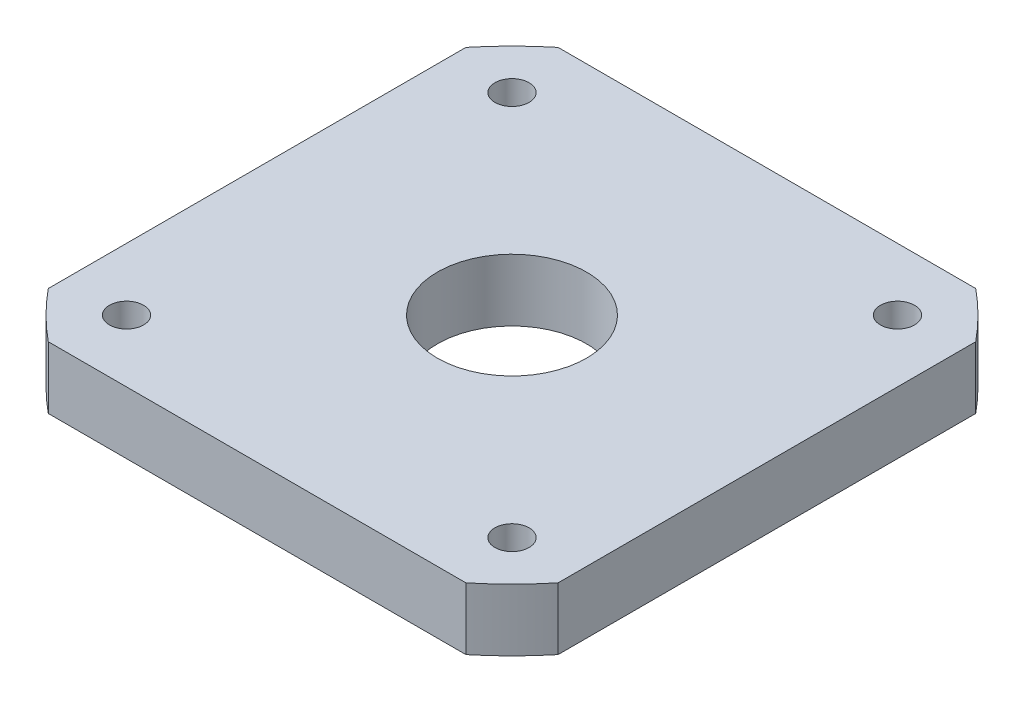
ISO-10303-21;
HEADER;
FILE_DESCRIPTION(('STEP AP214'),'2;1');
FILE_NAME('part.step','',(''),(''),'','','');
FILE_SCHEMA(('AUTOMOTIVE_DESIGN { 1 0 10303 214 1 1 1 1 }'));
ENDSEC;
DATA;
#1=APPLICATION_CONTEXT('core data for automotive mechanical design processes');
#2=APPLICATION_PROTOCOL_DEFINITION('international standard','automotive_design',2000,#1);
#3=PRODUCT_CONTEXT('',#1,'mechanical');
#4=PRODUCT('Part','Part','',(#3));
#5=PRODUCT_RELATED_PRODUCT_CATEGORY('part','',(#4));
#6=PRODUCT_DEFINITION_FORMATION('','',#4);
#7=PRODUCT_DEFINITION_CONTEXT('part definition',#1,'design');
#8=PRODUCT_DEFINITION('design','',#6,#7);
#9=PRODUCT_DEFINITION_SHAPE('','',#8);
#10=(LENGTH_UNIT() NAMED_UNIT(*) SI_UNIT(.MILLI.,.METRE.));
#11=(NAMED_UNIT(*) PLANE_ANGLE_UNIT() SI_UNIT($,.RADIAN.));
#12=(NAMED_UNIT(*) SI_UNIT($,.STERADIAN.) SOLID_ANGLE_UNIT());
#13=UNCERTAINTY_MEASURE_WITH_UNIT(LENGTH_MEASURE(1.E-05),#10,'distance_accuracy_value','');
#14=(GEOMETRIC_REPRESENTATION_CONTEXT(3) GLOBAL_UNCERTAINTY_ASSIGNED_CONTEXT((#13)) GLOBAL_UNIT_ASSIGNED_CONTEXT((#10,
#11,#12)) REPRESENTATION_CONTEXT('',''));
#15=CARTESIAN_POINT('',(0.,0.,0.));
#16=DIRECTION('',(0.,0.,1.));
#17=DIRECTION('',(1.,0.,0.));
#18=AXIS2_PLACEMENT_3D('',#15,#16,#17);
#19=CARTESIAN_POINT('',(-0.499999999999889,-8.73972731136372,4.7175293035262E-11));
#20=DIRECTION('',(0.,1.,0.));
#21=DIRECTION('',(0.,0.,1.));
#22=AXIS2_PLACEMENT_3D('',#19,#20,#21);
#23=PLANE('',#22);
#24=CARTESIAN_POINT('',(-15.9999999999999,-8.73972731136403,15.5000000000507));
#25=DIRECTION('',(0.,1.,0.));
#26=DIRECTION('',(0.,0.,1.));
#27=AXIS2_PLACEMENT_3D('',#24,#25,#26);
#28=CIRCLE('',#27,1.375);
#29=CARTESIAN_POINT('',(-15.9999999999999,-8.73972731136405,16.8750000000507));
#30=VERTEX_POINT('',#29);
#31=EDGE_CURVE('E199',#30,#30,#28,.T.);
#32=ORIENTED_EDGE('',*,*,#31,.F.);
#33=EDGE_LOOP('',(#32));
#34=FACE_BOUND('',#33,.T.);
#35=CARTESIAN_POINT('',(-15.9999999999999,-8.73972731136342,-15.49999999995));
#36=DIRECTION('',(0.,1.,0.));
#37=DIRECTION('',(0.,0.,1.));
#38=AXIS2_PLACEMENT_3D('',#35,#36,#37);
#39=CIRCLE('',#38,1.375);
#40=CARTESIAN_POINT('',(-15.9999999999999,-8.73972731136345,-14.12499999995));
#41=VERTEX_POINT('',#40);
#42=EDGE_CURVE('E187',#41,#41,#39,.T.);
#43=ORIENTED_EDGE('',*,*,#42,.F.);
#44=EDGE_LOOP('',(#43));
#45=FACE_BOUND('',#44,.T.);
#46=CARTESIAN_POINT('',(-0.499999999999889,-8.73972731136372,4.7175293035262E-11));
#47=DIRECTION('',(0.,1.,0.));
#48=DIRECTION('',(0.,0.,1.));
#49=AXIS2_PLACEMENT_3D('',#46,#47,#48);
#50=CIRCLE('',#49,26.4999999999986);
#51=CARTESIAN_POINT('',(20.0000000000001,-8.73972731136339,-16.7928556236976));
#52=VERTEX_POINT('',#51);
#53=CARTESIAN_POINT('',(16.2928556237471,-8.73972731136332,-20.4999999999506));
#54=VERTEX_POINT('',#53);
#55=EDGE_CURVE('E151',#52,#54,#50,.T.);
#56=ORIENTED_EDGE('',*,*,#55,.T.);
#57=DIRECTION('',(-1.,0.,0.));
#58=VECTOR('',#57,1.);
#59=CARTESIAN_POINT('',(16.2928556237471,-8.73972731136332,-20.4999999999506));
#60=LINE('',#59,#58);
#61=CARTESIAN_POINT('',(-17.2928556237399,-8.73972731136332,-20.4999999999506));
#62=VERTEX_POINT('',#61);
#63=EDGE_CURVE('E97',#54,#62,#60,.T.);
#64=ORIENTED_EDGE('',*,*,#63,.T.);
#65=CARTESIAN_POINT('',(-0.499999999999889,-8.73972731136372,4.7175293035262E-11));
#66=DIRECTION('',(0.,1.,0.));
#67=DIRECTION('',(0.,0.,1.));
#68=AXIS2_PLACEMENT_3D('',#65,#66,#67);
#69=CIRCLE('',#68,26.4999999999953);
#70=CARTESIAN_POINT('',(-20.9999999999972,-8.73972731136339,-16.7928556236954));
#71=VERTEX_POINT('',#70);
#72=EDGE_CURVE('E167',#62,#71,#69,.T.);
#73=ORIENTED_EDGE('',*,*,#72,.T.);
#74=DIRECTION('',(0.,0.,1.));
#75=VECTOR('',#74,1.);
#76=CARTESIAN_POINT('',(-20.9999999999982,-8.73972731136339,-16.7928556236962));
#77=LINE('',#76,#75);
#78=CARTESIAN_POINT('',(-20.9999999999999,-8.73972731136405,16.7928556237894));
#79=VERTEX_POINT('',#78);
#80=EDGE_CURVE('E176',#71,#79,#77,.T.);
#81=ORIENTED_EDGE('',*,*,#80,.T.);
#82=CARTESIAN_POINT('',(-0.499999999999889,-8.73972731136372,4.7175293035262E-11));
#83=DIRECTION('',(0.,1.,0.));
#84=DIRECTION('',(0.,0.,1.));
#85=AXIS2_PLACEMENT_3D('',#82,#83,#84);
#86=CIRCLE('',#85,26.4999999999974);
#87=CARTESIAN_POINT('',(-17.2928556237398,-8.73972731136412,20.5000000000493));
#88=VERTEX_POINT('',#87);
#89=EDGE_CURVE('E117',#79,#88,#86,.T.);
#90=ORIENTED_EDGE('',*,*,#89,.T.);
#91=DIRECTION('',(1.,0.,0.));
#92=VECTOR('',#91,1.);
#93=CARTESIAN_POINT('',(-17.2928556237399,-8.73972731136412,20.5000000000494));
#94=LINE('',#93,#92);
#95=CARTESIAN_POINT('',(16.2928556237471,-8.73972731136412,20.5000000000494));
#96=VERTEX_POINT('',#95);
#97=EDGE_CURVE('E115',#88,#96,#94,.T.);
#98=ORIENTED_EDGE('',*,*,#97,.T.);
#99=CARTESIAN_POINT('',(-0.499999999999889,-8.73972731136372,4.7175293035262E-11));
#100=DIRECTION('',(0.,1.,0.));
#101=DIRECTION('',(0.,0.,1.));
#102=AXIS2_PLACEMENT_3D('',#99,#100,#101);
#103=CIRCLE('',#102,26.5000000000007);
#104=CARTESIAN_POINT('',(20.0000000000028,-8.73972731136405,16.7928556237916));
#105=VERTEX_POINT('',#104);
#106=EDGE_CURVE('E116',#96,#105,#103,.T.);
#107=ORIENTED_EDGE('',*,*,#106,.T.);
#108=DIRECTION('',(0.,0.,-1.));
#109=VECTOR('',#108,1.);
#110=CARTESIAN_POINT('',(20.0000000000018,-8.73972731136405,16.7928556237908));
#111=LINE('',#110,#109);
#112=EDGE_CURVE('E57',#105,#52,#111,.T.);
#113=ORIENTED_EDGE('',*,*,#112,.T.);
#114=EDGE_LOOP('',(#56,#64,#73,#81,#90,#98,#107,#113));
#115=FACE_BOUND('',#114,.T.);
#116=CARTESIAN_POINT('',(-0.499999999999889,-8.73972731136372,4.7175293035262E-11));
#117=DIRECTION('',(0.,1.,0.));
#118=DIRECTION('',(0.,0.,1.));
#119=AXIS2_PLACEMENT_3D('',#116,#117,#118);
#120=CIRCLE('',#119,6.00000000001366);
#121=CARTESIAN_POINT('',(-0.499999999999889,-8.73972731136384,6.00000000006084));
#122=VERTEX_POINT('',#121);
#123=EDGE_CURVE('E138',#122,#122,#120,.T.);
#124=ORIENTED_EDGE('',*,*,#123,.F.);
#125=EDGE_LOOP('',(#124));
#126=FACE_BOUND('',#125,.T.);
#127=CARTESIAN_POINT('',(15.0000000000001,-8.73972731136342,-15.4999999999494));
#128=DIRECTION('',(0.,1.,0.));
#129=DIRECTION('',(0.,0.,1.));
#130=AXIS2_PLACEMENT_3D('',#127,#128,#129);
#131=CIRCLE('',#130,1.375);
#132=CARTESIAN_POINT('',(15.0000000000001,-8.73972731136345,-14.1249999999494));
#133=VERTEX_POINT('',#132);
#134=EDGE_CURVE('E191',#133,#133,#131,.T.);
#135=ORIENTED_EDGE('',*,*,#134,.F.);
#136=EDGE_LOOP('',(#135));
#137=FACE_BOUND('',#136,.T.);
#138=CARTESIAN_POINT('',(15.0000000000001,-8.73972731136403,15.5000000000494));
#139=DIRECTION('',(0.,1.,0.));
#140=DIRECTION('',(0.,0.,1.));
#141=AXIS2_PLACEMENT_3D('',#138,#139,#140);
#142=CIRCLE('',#141,1.375);
#143=CARTESIAN_POINT('',(15.0000000000001,-8.73972731136405,16.8750000000494));
#144=VERTEX_POINT('',#143);
#145=EDGE_CURVE('E206',#144,#144,#142,.T.);
#146=ORIENTED_EDGE('',*,*,#145,.F.);
#147=EDGE_LOOP('',(#146));
#148=FACE_BOUND('',#147,.T.);
#149=ADVANCED_FACE('F39',(#34,#45,#115,#126,#137,#148),#23,.T.);
#150=CARTESIAN_POINT('',(-0.499999999999889,-13.7397273113637,4.70766485950967E-11));
#151=DIRECTION('',(0.,1.,0.));
#152=DIRECTION('',(0.,0.,1.));
#153=AXIS2_PLACEMENT_3D('',#150,#151,#152);
#154=PLANE('',#153);
#155=CARTESIAN_POINT('',(-0.499999999999889,-13.7397273113637,4.70766485950967E-11));
#156=DIRECTION('',(0.,1.,0.));
#157=DIRECTION('',(0.,0.,1.));
#158=AXIS2_PLACEMENT_3D('',#155,#156,#157);
#159=CIRCLE('',#158,26.4999999999986);
#160=CARTESIAN_POINT('',(20.0000000000001,-13.7397273113634,-16.7928556236977));
#161=VERTEX_POINT('',#160);
#162=CARTESIAN_POINT('',(16.2928556237471,-13.7397273113633,-20.4999999999507));
#163=VERTEX_POINT('',#162);
#164=EDGE_CURVE('E137',#161,#163,#159,.T.);
#165=ORIENTED_EDGE('',*,*,#164,.F.);
#166=DIRECTION('',(0.,0.,-1.));
#167=VECTOR('',#166,1.);
#168=CARTESIAN_POINT('',(20.0000000000018,-13.7397273113641,16.7928556237907));
#169=LINE('',#168,#167);
#170=CARTESIAN_POINT('',(20.0000000000028,-13.7397273113641,16.7928556237915));
#171=VERTEX_POINT('',#170);
#172=EDGE_CURVE('E93',#171,#161,#169,.T.);
#173=ORIENTED_EDGE('',*,*,#172,.F.);
#174=CARTESIAN_POINT('',(-0.499999999999889,-13.7397273113637,4.70766485950967E-11));
#175=DIRECTION('',(0.,1.,0.));
#176=DIRECTION('',(0.,0.,1.));
#177=AXIS2_PLACEMENT_3D('',#174,#175,#176);
#178=CIRCLE('',#177,26.5000000000007);
#179=CARTESIAN_POINT('',(16.2928556237471,-13.7397273113641,20.5000000000493));
#180=VERTEX_POINT('',#179);
#181=EDGE_CURVE('E83',#180,#171,#178,.T.);
#182=ORIENTED_EDGE('',*,*,#181,.F.);
#183=DIRECTION('',(1.,0.,0.));
#184=VECTOR('',#183,1.);
#185=CARTESIAN_POINT('',(-17.2928556237399,-13.7397273113641,20.5000000000493));
#186=LINE('',#185,#184);
#187=CARTESIAN_POINT('',(-17.2928556237398,-13.7397273113641,20.5000000000492));
#188=VERTEX_POINT('',#187);
#189=EDGE_CURVE('E127',#188,#180,#186,.T.);
#190=ORIENTED_EDGE('',*,*,#189,.F.);
#191=CARTESIAN_POINT('',(-0.499999999999889,-13.7397273113637,4.70766485950967E-11));
#192=DIRECTION('',(0.,1.,0.));
#193=DIRECTION('',(0.,0.,1.));
#194=AXIS2_PLACEMENT_3D('',#191,#192,#193);
#195=CIRCLE('',#194,26.4999999999974);
#196=CARTESIAN_POINT('',(-20.9999999999999,-13.7397273113641,16.7928556237893));
#197=VERTEX_POINT('',#196);
#198=EDGE_CURVE('E148',#197,#188,#195,.T.);
#199=ORIENTED_EDGE('',*,*,#198,.F.);
#200=DIRECTION('',(0.,0.,1.));
#201=VECTOR('',#200,1.);
#202=CARTESIAN_POINT('',(-20.9999999999982,-13.7397273113634,-16.7928556236963));
#203=LINE('',#202,#201);
#204=CARTESIAN_POINT('',(-20.9999999999972,-13.7397273113634,-16.7928556236955));
#205=VERTEX_POINT('',#204);
#206=EDGE_CURVE('E145',#205,#197,#203,.T.);
#207=ORIENTED_EDGE('',*,*,#206,.F.);
#208=CARTESIAN_POINT('',(-0.499999999999889,-13.7397273113637,4.70766485950967E-11));
#209=DIRECTION('',(0.,1.,0.));
#210=DIRECTION('',(0.,0.,1.));
#211=AXIS2_PLACEMENT_3D('',#208,#209,#210);
#212=CIRCLE('',#211,26.4999999999953);
#213=CARTESIAN_POINT('',(-17.2928556237399,-13.7397273113633,-20.4999999999507));
#214=VERTEX_POINT('',#213);
#215=EDGE_CURVE('E142',#214,#205,#212,.T.);
#216=ORIENTED_EDGE('',*,*,#215,.F.);
#217=DIRECTION('',(-1.,0.,0.));
#218=VECTOR('',#217,1.);
#219=CARTESIAN_POINT('',(16.2928556237471,-13.7397273113633,-20.4999999999507));
#220=LINE('',#219,#218);
#221=EDGE_CURVE('E136',#163,#214,#220,.T.);
#222=ORIENTED_EDGE('',*,*,#221,.F.);
#223=EDGE_LOOP('',(#165,#173,#182,#190,#199,#207,#216,#222));
#224=FACE_BOUND('',#223,.T.);
#225=CARTESIAN_POINT('',(-0.499999999999889,-13.7397273113637,4.70766485950967E-11));
#226=DIRECTION('',(0.,1.,0.));
#227=DIRECTION('',(0.,0.,1.));
#228=AXIS2_PLACEMENT_3D('',#225,#226,#227);
#229=CIRCLE('',#228,6.00000000001366);
#230=CARTESIAN_POINT('',(-0.499999999999889,-13.7397273113638,6.00000000006074));
#231=VERTEX_POINT('',#230);
#232=EDGE_CURVE('E183',#231,#231,#229,.T.);
#233=ORIENTED_EDGE('',*,*,#232,.T.);
#234=EDGE_LOOP('',(#233));
#235=FACE_BOUND('',#234,.T.);
#236=CARTESIAN_POINT('',(-15.9999999999999,-13.7397273113634,-15.4999999999501));
#237=DIRECTION('',(0.,1.,0.));
#238=DIRECTION('',(0.,0.,1.));
#239=AXIS2_PLACEMENT_3D('',#236,#237,#238);
#240=CIRCLE('',#239,1.375);
#241=CARTESIAN_POINT('',(-15.9999999999999,-13.7397273113634,-14.1249999999501));
#242=VERTEX_POINT('',#241);
#243=EDGE_CURVE('E192',#242,#242,#240,.T.);
#244=ORIENTED_EDGE('',*,*,#243,.T.);
#245=EDGE_LOOP('',(#244));
#246=FACE_BOUND('',#245,.T.);
#247=CARTESIAN_POINT('',(15.0000000000001,-13.7397273113634,-15.4999999999495));
#248=DIRECTION('',(0.,1.,0.));
#249=DIRECTION('',(0.,0.,1.));
#250=AXIS2_PLACEMENT_3D('',#247,#248,#249);
#251=CIRCLE('',#250,1.375);
#252=CARTESIAN_POINT('',(15.0000000000001,-13.7397273113634,-14.1249999999495));
#253=VERTEX_POINT('',#252);
#254=EDGE_CURVE('E197',#253,#253,#251,.T.);
#255=ORIENTED_EDGE('',*,*,#254,.T.);
#256=EDGE_LOOP('',(#255));
#257=FACE_BOUND('',#256,.T.);
#258=CARTESIAN_POINT('',(-15.9999999999999,-13.739727311364,15.5000000000506));
#259=DIRECTION('',(0.,1.,0.));
#260=DIRECTION('',(0.,0.,1.));
#261=AXIS2_PLACEMENT_3D('',#258,#259,#260);
#262=CIRCLE('',#261,1.375);
#263=CARTESIAN_POINT('',(-15.9999999999999,-13.7397273113641,16.8750000000506));
#264=VERTEX_POINT('',#263);
#265=EDGE_CURVE('E201',#264,#264,#262,.T.);
#266=ORIENTED_EDGE('',*,*,#265,.T.);
#267=EDGE_LOOP('',(#266));
#268=FACE_BOUND('',#267,.T.);
#269=CARTESIAN_POINT('',(15.0000000000001,-13.739727311364,15.5000000000493));
#270=DIRECTION('',(0.,1.,0.));
#271=DIRECTION('',(0.,0.,1.));
#272=AXIS2_PLACEMENT_3D('',#269,#270,#271);
#273=CIRCLE('',#272,1.375);
#274=CARTESIAN_POINT('',(15.0000000000001,-13.7397273113641,16.8750000000493));
#275=VERTEX_POINT('',#274);
#276=EDGE_CURVE('E207',#275,#275,#273,.T.);
#277=ORIENTED_EDGE('',*,*,#276,.T.);
#278=EDGE_LOOP('',(#277));
#279=FACE_BOUND('',#278,.T.);
#280=ADVANCED_FACE('F168',(#224,#235,#246,#257,#268,#279),#154,.F.);
#281=CARTESIAN_POINT('',(-0.499999999999889,-8.73972731136372,4.7175293035262E-11));
#282=DIRECTION('',(0.,-1.,0.));
#283=DIRECTION('',(0.,0.,-1.));
#284=AXIS2_PLACEMENT_3D('',#281,#282,#283);
#285=CYLINDRICAL_SURFACE('',#284,26.4999999999986);
#286=ORIENTED_EDGE('',*,*,#164,.T.);
#287=DIRECTION('',(0.,-1.,0.));
#288=VECTOR('',#287,1.);
#289=CARTESIAN_POINT('',(16.2928556237471,-8.73972731136332,-20.4999999999506));
#290=LINE('',#289,#288);
#291=EDGE_CURVE('E11',#54,#163,#290,.T.);
#292=ORIENTED_EDGE('',*,*,#291,.F.);
#293=ORIENTED_EDGE('',*,*,#55,.F.);
#294=DIRECTION('',(0.,-1.,0.));
#295=VECTOR('',#294,1.);
#296=CARTESIAN_POINT('',(20.0000000000001,-8.73972731136339,-16.7928556236976));
#297=LINE('',#296,#295);
#298=EDGE_CURVE('E135',#52,#161,#297,.T.);
#299=ORIENTED_EDGE('',*,*,#298,.T.);
#300=EDGE_LOOP('',(#286,#292,#293,#299));
#301=FACE_BOUND('',#300,.T.);
#302=ADVANCED_FACE('F41',(#301),#285,.T.);
#303=CARTESIAN_POINT('',(16.2928556237471,-8.73972731136332,-20.4999999999506));
#304=DIRECTION('',(0.,0.,1.));
#305=DIRECTION('',(0.,-1.,0.));
#306=AXIS2_PLACEMENT_3D('',#303,#304,#305);
#307=PLANE('',#306);
#308=ORIENTED_EDGE('',*,*,#221,.T.);
#309=DIRECTION('',(0.,-1.,0.));
#310=VECTOR('',#309,1.);
#311=CARTESIAN_POINT('',(-17.2928556237399,-8.73972731136332,-20.4999999999506));
#312=LINE('',#311,#310);
#313=EDGE_CURVE('E48',#62,#214,#312,.T.);
#314=ORIENTED_EDGE('',*,*,#313,.F.);
#315=ORIENTED_EDGE('',*,*,#63,.F.);
#316=ORIENTED_EDGE('',*,*,#291,.T.);
#317=EDGE_LOOP('',(#308,#314,#315,#316));
#318=FACE_BOUND('',#317,.T.);
#319=ADVANCED_FACE('F242',(#318),#307,.F.);
#320=CARTESIAN_POINT('',(-0.499999999999889,-8.73972731136372,4.7175293035262E-11));
#321=DIRECTION('',(0.,-1.,0.));
#322=DIRECTION('',(0.,0.,-1.));
#323=AXIS2_PLACEMENT_3D('',#320,#321,#322);
#324=CYLINDRICAL_SURFACE('',#323,26.4999999999953);
#325=ORIENTED_EDGE('',*,*,#215,.T.);
#326=DIRECTION('',(0.,-1.,0.));
#327=VECTOR('',#326,1.);
#328=CARTESIAN_POINT('',(-20.9999999999972,-8.73972731136339,-16.7928556236954));
#329=LINE('',#328,#327);
#330=EDGE_CURVE('E158',#71,#205,#329,.T.);
#331=ORIENTED_EDGE('',*,*,#330,.F.);
#332=ORIENTED_EDGE('',*,*,#72,.F.);
#333=ORIENTED_EDGE('',*,*,#313,.T.);
#334=EDGE_LOOP('',(#325,#331,#332,#333));
#335=FACE_BOUND('',#334,.T.);
#336=ADVANCED_FACE('F163',(#335),#324,.T.);
#337=CARTESIAN_POINT('',(-20.9999999999982,-8.73972731136339,-16.7928556236962));
#338=DIRECTION('',(1.,0.,0.));
#339=DIRECTION('',(0.,0.,-1.));
#340=AXIS2_PLACEMENT_3D('',#337,#338,#339);
#341=PLANE('',#340);
#342=ORIENTED_EDGE('',*,*,#206,.T.);
#343=DIRECTION('',(0.,-1.,0.));
#344=VECTOR('',#343,1.);
#345=CARTESIAN_POINT('',(-20.9999999999999,-8.73972731136405,16.7928556237894));
#346=LINE('',#345,#344);
#347=EDGE_CURVE('E154',#79,#197,#346,.T.);
#348=ORIENTED_EDGE('',*,*,#347,.F.);
#349=ORIENTED_EDGE('',*,*,#80,.F.);
#350=ORIENTED_EDGE('',*,*,#330,.T.);
#351=EDGE_LOOP('',(#342,#348,#349,#350));
#352=FACE_BOUND('',#351,.T.);
#353=ADVANCED_FACE('F174',(#352),#341,.F.);
#354=CARTESIAN_POINT('',(-0.499999999999889,-8.73972731136372,4.7175293035262E-11));
#355=DIRECTION('',(0.,-1.,0.));
#356=DIRECTION('',(0.,0.,-1.));
#357=AXIS2_PLACEMENT_3D('',#354,#355,#356);
#358=CYLINDRICAL_SURFACE('',#357,26.4999999999974);
#359=ORIENTED_EDGE('',*,*,#198,.T.);
#360=DIRECTION('',(0.,-1.,0.));
#361=VECTOR('',#360,1.);
#362=CARTESIAN_POINT('',(-17.2928556237398,-8.73972731136412,20.5000000000493));
#363=LINE('',#362,#361);
#364=EDGE_CURVE('E130',#88,#188,#363,.T.);
#365=ORIENTED_EDGE('',*,*,#364,.F.);
#366=ORIENTED_EDGE('',*,*,#89,.F.);
#367=ORIENTED_EDGE('',*,*,#347,.T.);
#368=EDGE_LOOP('',(#359,#365,#366,#367));
#369=FACE_BOUND('',#368,.T.);
#370=ADVANCED_FACE('F179',(#369),#358,.T.);
#371=CARTESIAN_POINT('',(-17.2928556237399,-8.73972731136412,20.5000000000494));
#372=DIRECTION('',(0.,0.,-1.));
#373=DIRECTION('',(0.,1.,0.));
#374=AXIS2_PLACEMENT_3D('',#371,#372,#373);
#375=PLANE('',#374);
#376=ORIENTED_EDGE('',*,*,#189,.T.);
#377=DIRECTION('',(0.,-1.,0.));
#378=VECTOR('',#377,1.);
#379=CARTESIAN_POINT('',(16.2928556237471,-8.73972731136412,20.5000000000494));
#380=LINE('',#379,#378);
#381=EDGE_CURVE('E124',#96,#180,#380,.T.);
#382=ORIENTED_EDGE('',*,*,#381,.F.);
#383=ORIENTED_EDGE('',*,*,#97,.F.);
#384=ORIENTED_EDGE('',*,*,#364,.T.);
#385=EDGE_LOOP('',(#376,#382,#383,#384));
#386=FACE_BOUND('',#385,.T.);
#387=ADVANCED_FACE('F121',(#386),#375,.F.);
#388=CARTESIAN_POINT('',(-0.499999999999889,-8.73972731136372,4.7175293035262E-11));
#389=DIRECTION('',(0.,-1.,0.));
#390=DIRECTION('',(0.,0.,-1.));
#391=AXIS2_PLACEMENT_3D('',#388,#389,#390);
#392=CYLINDRICAL_SURFACE('',#391,26.5000000000007);
#393=ORIENTED_EDGE('',*,*,#181,.T.);
#394=DIRECTION('',(0.,-1.,0.));
#395=VECTOR('',#394,1.);
#396=CARTESIAN_POINT('',(20.0000000000028,-8.73972731136405,16.7928556237916));
#397=LINE('',#396,#395);
#398=EDGE_CURVE('E126',#105,#171,#397,.T.);
#399=ORIENTED_EDGE('',*,*,#398,.F.);
#400=ORIENTED_EDGE('',*,*,#106,.F.);
#401=ORIENTED_EDGE('',*,*,#381,.T.);
#402=EDGE_LOOP('',(#393,#399,#400,#401));
#403=FACE_BOUND('',#402,.T.);
#404=ADVANCED_FACE('F128',(#403),#392,.T.);
#405=CARTESIAN_POINT('',(20.0000000000018,-8.73972731136405,16.7928556237908));
#406=DIRECTION('',(-1.,0.,0.));
#407=DIRECTION('',(0.,0.,1.));
#408=AXIS2_PLACEMENT_3D('',#405,#406,#407);
#409=PLANE('',#408);
#410=ORIENTED_EDGE('',*,*,#172,.T.);
#411=ORIENTED_EDGE('',*,*,#298,.F.);
#412=ORIENTED_EDGE('',*,*,#112,.F.);
#413=ORIENTED_EDGE('',*,*,#398,.T.);
#414=EDGE_LOOP('',(#410,#411,#412,#413));
#415=FACE_BOUND('',#414,.T.);
#416=ADVANCED_FACE('F232',(#415),#409,.F.);
#417=CARTESIAN_POINT('',(-0.499999999999889,-8.73972731136372,4.7175293035262E-11));
#418=DIRECTION('',(0.,-1.,0.));
#419=DIRECTION('',(0.,0.,-1.));
#420=AXIS2_PLACEMENT_3D('',#417,#418,#419);
#421=CYLINDRICAL_SURFACE('',#420,6.00000000001366);
#422=ORIENTED_EDGE('',*,*,#123,.T.);
#423=EDGE_LOOP('',(#422));
#424=FACE_BOUND('',#423,.T.);
#425=ORIENTED_EDGE('',*,*,#232,.F.);
#426=EDGE_LOOP('',(#425));
#427=FACE_BOUND('',#426,.T.);
#428=ADVANCED_FACE('F227',(#424,#427),#421,.F.);
#429=CARTESIAN_POINT('',(-15.9999999999999,-8.73972731136342,-15.49999999995));
#430=DIRECTION('',(0.,-1.,0.));
#431=DIRECTION('',(0.,0.,-1.));
#432=AXIS2_PLACEMENT_3D('',#429,#430,#431);
#433=CYLINDRICAL_SURFACE('',#432,1.375);
#434=ORIENTED_EDGE('',*,*,#42,.T.);
#435=EDGE_LOOP('',(#434));
#436=FACE_BOUND('',#435,.T.);
#437=ORIENTED_EDGE('',*,*,#243,.F.);
#438=EDGE_LOOP('',(#437));
#439=FACE_BOUND('',#438,.T.);
#440=ADVANCED_FACE('F308',(#436,#439),#433,.F.);
#441=CARTESIAN_POINT('',(15.0000000000001,-8.73972731136342,-15.4999999999494));
#442=DIRECTION('',(0.,-1.,0.));
#443=DIRECTION('',(0.,0.,-1.));
#444=AXIS2_PLACEMENT_3D('',#441,#442,#443);
#445=CYLINDRICAL_SURFACE('',#444,1.375);
#446=ORIENTED_EDGE('',*,*,#134,.T.);
#447=EDGE_LOOP('',(#446));
#448=FACE_BOUND('',#447,.T.);
#449=ORIENTED_EDGE('',*,*,#254,.F.);
#450=EDGE_LOOP('',(#449));
#451=FACE_BOUND('',#450,.T.);
#452=ADVANCED_FACE('F314',(#448,#451),#445,.F.);
#453=CARTESIAN_POINT('',(-15.9999999999999,-8.73972731136403,15.5000000000507));
#454=DIRECTION('',(0.,-1.,0.));
#455=DIRECTION('',(0.,0.,-1.));
#456=AXIS2_PLACEMENT_3D('',#453,#454,#455);
#457=CYLINDRICAL_SURFACE('',#456,1.375);
#458=ORIENTED_EDGE('',*,*,#31,.T.);
#459=EDGE_LOOP('',(#458));
#460=FACE_BOUND('',#459,.T.);
#461=ORIENTED_EDGE('',*,*,#265,.F.);
#462=EDGE_LOOP('',(#461));
#463=FACE_BOUND('',#462,.T.);
#464=ADVANCED_FACE('F325',(#460,#463),#457,.F.);
#465=CARTESIAN_POINT('',(15.0000000000001,-8.73972731136403,15.5000000000494));
#466=DIRECTION('',(0.,-1.,0.));
#467=DIRECTION('',(0.,0.,-1.));
#468=AXIS2_PLACEMENT_3D('',#465,#466,#467);
#469=CYLINDRICAL_SURFACE('',#468,1.375);
#470=ORIENTED_EDGE('',*,*,#145,.T.);
#471=EDGE_LOOP('',(#470));
#472=FACE_BOUND('',#471,.T.);
#473=ORIENTED_EDGE('',*,*,#276,.F.);
#474=EDGE_LOOP('',(#473));
#475=FACE_BOUND('',#474,.T.);
#476=ADVANCED_FACE('F214',(#472,#475),#469,.F.);
#477=CLOSED_SHELL('',(#149,#280,#302,#319,#336,#353,#370,#387,#404,#416,#428,#440,#452,#464,#476));
#478=MANIFOLD_SOLID_BREP('B2',#477);
#479=ADVANCED_BREP_SHAPE_REPRESENTATION('',(#18,#478),#14);
#480=SHAPE_DEFINITION_REPRESENTATION(#9,#479);
ENDSEC;
END-ISO-10303-21;
